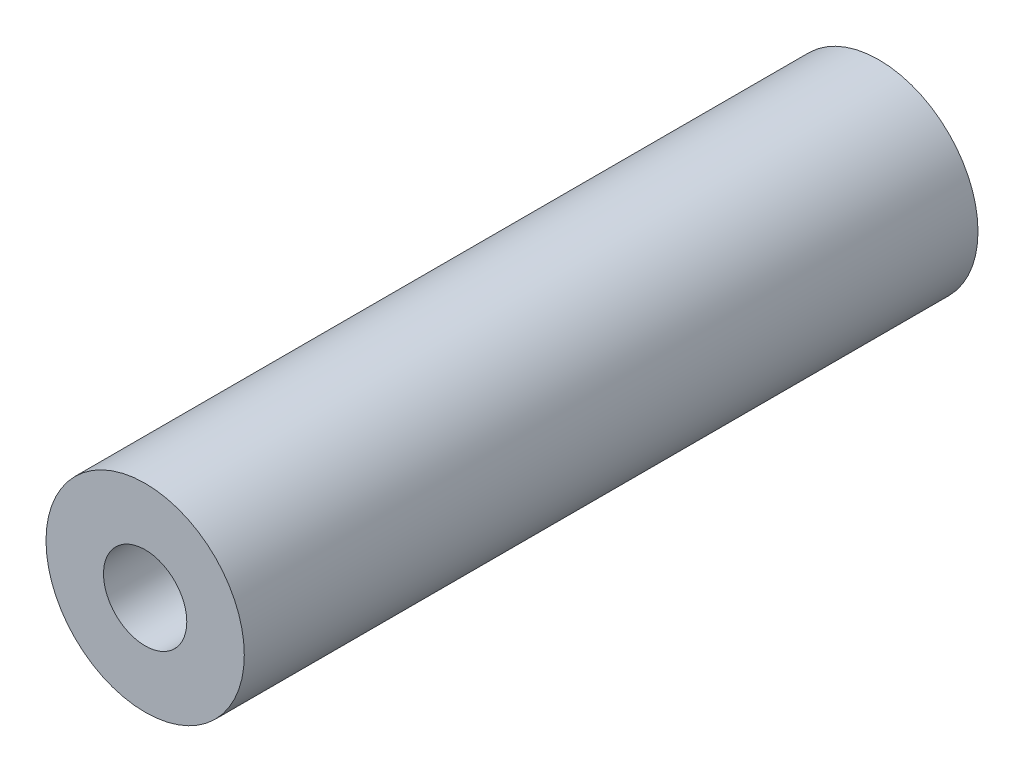
ISO-10303-21;
HEADER;
FILE_DESCRIPTION(('STEP AP214'),'2;1');
FILE_NAME('part.step','',(''),(''),'','','');
FILE_SCHEMA(('AUTOMOTIVE_DESIGN { 1 0 10303 214 1 1 1 1 }'));
ENDSEC;
DATA;
#1=APPLICATION_CONTEXT('core data for automotive mechanical design processes');
#2=APPLICATION_PROTOCOL_DEFINITION('international standard','automotive_design',2000,#1);
#3=PRODUCT_CONTEXT('',#1,'mechanical');
#4=PRODUCT('Part','Part','',(#3));
#5=PRODUCT_RELATED_PRODUCT_CATEGORY('part','',(#4));
#6=PRODUCT_DEFINITION_FORMATION('','',#4);
#7=PRODUCT_DEFINITION_CONTEXT('part definition',#1,'design');
#8=PRODUCT_DEFINITION('design','',#6,#7);
#9=PRODUCT_DEFINITION_SHAPE('','',#8);
#10=(LENGTH_UNIT() NAMED_UNIT(*) SI_UNIT(.MILLI.,.METRE.));
#11=(NAMED_UNIT(*) PLANE_ANGLE_UNIT() SI_UNIT($,.RADIAN.));
#12=(NAMED_UNIT(*) SI_UNIT($,.STERADIAN.) SOLID_ANGLE_UNIT());
#13=UNCERTAINTY_MEASURE_WITH_UNIT(LENGTH_MEASURE(1.E-05),#10,'distance_accuracy_value','');
#14=(GEOMETRIC_REPRESENTATION_CONTEXT(3) GLOBAL_UNCERTAINTY_ASSIGNED_CONTEXT((#13)) GLOBAL_UNIT_ASSIGNED_CONTEXT((#10,
#11,#12)) REPRESENTATION_CONTEXT('',''));
#15=CARTESIAN_POINT('',(0.,0.,0.));
#16=DIRECTION('',(0.,0.,1.));
#17=DIRECTION('',(1.,0.,0.));
#18=AXIS2_PLACEMENT_3D('',#15,#16,#17);
#19=CARTESIAN_POINT('',(0.,0.,37.));
#20=DIRECTION('',(0.,0.,-1.));
#21=DIRECTION('',(-1.,0.,0.));
#22=AXIS2_PLACEMENT_3D('',#19,#20,#21);
#23=CYLINDRICAL_SURFACE('',#22,5.);
#24=CARTESIAN_POINT('',(0.,0.,37.));
#25=DIRECTION('',(0.,0.,1.));
#26=DIRECTION('',(1.,0.,0.));
#27=AXIS2_PLACEMENT_3D('',#24,#25,#26);
#28=CIRCLE('',#27,5.);
#29=CARTESIAN_POINT('',(5.,0.,37.));
#30=VERTEX_POINT('',#29);
#31=EDGE_CURVE('E11',#30,#30,#28,.T.);
#32=ORIENTED_EDGE('',*,*,#31,.F.);
#33=EDGE_LOOP('',(#32));
#34=FACE_BOUND('',#33,.T.);
#35=CARTESIAN_POINT('',(0.,0.,0.));
#36=DIRECTION('',(0.,0.,1.));
#37=DIRECTION('',(1.,0.,0.));
#38=AXIS2_PLACEMENT_3D('',#35,#36,#37);
#39=CIRCLE('',#38,5.);
#40=CARTESIAN_POINT('',(5.,0.,0.));
#41=VERTEX_POINT('',#40);
#42=EDGE_CURVE('E40',#41,#41,#39,.T.);
#43=ORIENTED_EDGE('',*,*,#42,.T.);
#44=EDGE_LOOP('',(#43));
#45=FACE_BOUND('',#44,.T.);
#46=ADVANCED_FACE('F37',(#34,#45),#23,.T.);
#47=CARTESIAN_POINT('',(0.,0.,37.));
#48=DIRECTION('',(0.,0.,1.));
#49=DIRECTION('',(1.,0.,0.));
#50=AXIS2_PLACEMENT_3D('',#47,#48,#49);
#51=PLANE('',#50);
#52=CARTESIAN_POINT('',(0.,0.,37.));
#53=DIRECTION('',(0.,0.,1.));
#54=DIRECTION('',(1.,0.,0.));
#55=AXIS2_PLACEMENT_3D('',#52,#53,#54);
#56=CIRCLE('',#55,2.1);
#57=CARTESIAN_POINT('',(2.1,0.,37.));
#58=VERTEX_POINT('',#57);
#59=EDGE_CURVE('E60',#58,#58,#56,.T.);
#60=ORIENTED_EDGE('',*,*,#59,.F.);
#61=EDGE_LOOP('',(#60));
#62=FACE_BOUND('',#61,.T.);
#63=ORIENTED_EDGE('',*,*,#31,.T.);
#64=EDGE_LOOP('',(#63));
#65=FACE_BOUND('',#64,.T.);
#66=ADVANCED_FACE('F79',(#62,#65),#51,.T.);
#67=CARTESIAN_POINT('',(0.,0.,0.));
#68=DIRECTION('',(0.,0.,1.));
#69=DIRECTION('',(1.,0.,0.));
#70=AXIS2_PLACEMENT_3D('',#67,#68,#69);
#71=PLANE('',#70);
#72=CARTESIAN_POINT('',(0.,0.,0.));
#73=DIRECTION('',(0.,0.,-1.));
#74=DIRECTION('',(-1.,0.,0.));
#75=AXIS2_PLACEMENT_3D('',#72,#73,#74);
#76=CIRCLE('',#75,2.1);
#77=CARTESIAN_POINT('',(-2.1,0.,0.));
#78=VERTEX_POINT('',#77);
#79=EDGE_CURVE('E61',#78,#78,#76,.T.);
#80=ORIENTED_EDGE('',*,*,#79,.F.);
#81=EDGE_LOOP('',(#80));
#82=FACE_BOUND('',#81,.T.);
#83=ORIENTED_EDGE('',*,*,#42,.F.);
#84=EDGE_LOOP('',(#83));
#85=FACE_BOUND('',#84,.T.);
#86=ADVANCED_FACE('F76',(#82,#85),#71,.F.);
#87=CARTESIAN_POINT('',(0.,0.,24.6));
#88=DIRECTION('',(0.,0.,1.));
#89=DIRECTION('',(1.,0.,0.));
#90=AXIS2_PLACEMENT_3D('',#87,#88,#89);
#91=CONICAL_SURFACE('',#90,2.1,1.02974425867665);
#92=CARTESIAN_POINT('',(0.,0.,23.3381927000421));
#93=VERTEX_POINT('',#92);
#94=VERTEX_LOOP('',#93);
#95=FACE_BOUND('',#94,.T.);
#96=CARTESIAN_POINT('',(0.,0.,24.6));
#97=DIRECTION('',(0.,0.,1.));
#98=DIRECTION('',(1.,0.,0.));
#99=AXIS2_PLACEMENT_3D('',#96,#97,#98);
#100=CIRCLE('',#99,2.1);
#101=CARTESIAN_POINT('',(2.1,0.,24.6));
#102=VERTEX_POINT('',#101);
#103=EDGE_CURVE('E64',#102,#102,#100,.T.);
#104=ORIENTED_EDGE('',*,*,#103,.T.);
#105=EDGE_LOOP('',(#104));
#106=FACE_BOUND('',#105,.T.);
#107=ADVANCED_FACE('F78',(#95,#106),#91,.F.);
#108=CARTESIAN_POINT('',(0.,0.,37.));
#109=DIRECTION('',(0.,0.,1.));
#110=DIRECTION('',(1.,0.,0.));
#111=AXIS2_PLACEMENT_3D('',#108,#109,#110);
#112=CYLINDRICAL_SURFACE('',#111,2.1);
#113=ORIENTED_EDGE('',*,*,#103,.F.);
#114=EDGE_LOOP('',(#113));
#115=FACE_BOUND('',#114,.T.);
#116=ORIENTED_EDGE('',*,*,#59,.T.);
#117=EDGE_LOOP('',(#116));
#118=FACE_BOUND('',#117,.T.);
#119=ADVANCED_FACE('F54',(#115,#118),#112,.F.);
#120=CARTESIAN_POINT('',(0.,0.,12.4));
#121=DIRECTION('',(0.,0.,-1.));
#122=DIRECTION('',(-1.,0.,0.));
#123=AXIS2_PLACEMENT_3D('',#120,#121,#122);
#124=CONICAL_SURFACE('',#123,2.1,1.02974425867665);
#125=CARTESIAN_POINT('',(0.,0.,13.6618072999579));
#126=VERTEX_POINT('',#125);
#127=VERTEX_LOOP('',#126);
#128=FACE_BOUND('',#127,.T.);
#129=CARTESIAN_POINT('',(0.,0.,12.4));
#130=DIRECTION('',(0.,0.,-1.));
#131=DIRECTION('',(-1.,0.,0.));
#132=AXIS2_PLACEMENT_3D('',#129,#130,#131);
#133=CIRCLE('',#132,2.1);
#134=CARTESIAN_POINT('',(-2.1,0.,12.4));
#135=VERTEX_POINT('',#134);
#136=EDGE_CURVE('E58',#135,#135,#133,.T.);
#137=ORIENTED_EDGE('',*,*,#136,.T.);
#138=EDGE_LOOP('',(#137));
#139=FACE_BOUND('',#138,.T.);
#140=ADVANCED_FACE('F50',(#128,#139),#124,.F.);
#141=CARTESIAN_POINT('',(0.,0.,0.));
#142=DIRECTION('',(0.,0.,-1.));
#143=DIRECTION('',(-1.,0.,0.));
#144=AXIS2_PLACEMENT_3D('',#141,#142,#143);
#145=CYLINDRICAL_SURFACE('',#144,2.1);
#146=ORIENTED_EDGE('',*,*,#136,.F.);
#147=EDGE_LOOP('',(#146));
#148=FACE_BOUND('',#147,.T.);
#149=ORIENTED_EDGE('',*,*,#79,.T.);
#150=EDGE_LOOP('',(#149));
#151=FACE_BOUND('',#150,.T.);
#152=ADVANCED_FACE('F53',(#148,#151),#145,.F.);
#153=CLOSED_SHELL('',(#46,#66,#86,#107,#119,#140,#152));
#154=MANIFOLD_SOLID_BREP('B2',#153);
#155=ADVANCED_BREP_SHAPE_REPRESENTATION('',(#18,#154),#14);
#156=SHAPE_DEFINITION_REPRESENTATION(#9,#155);
ENDSEC;
END-ISO-10303-21;
